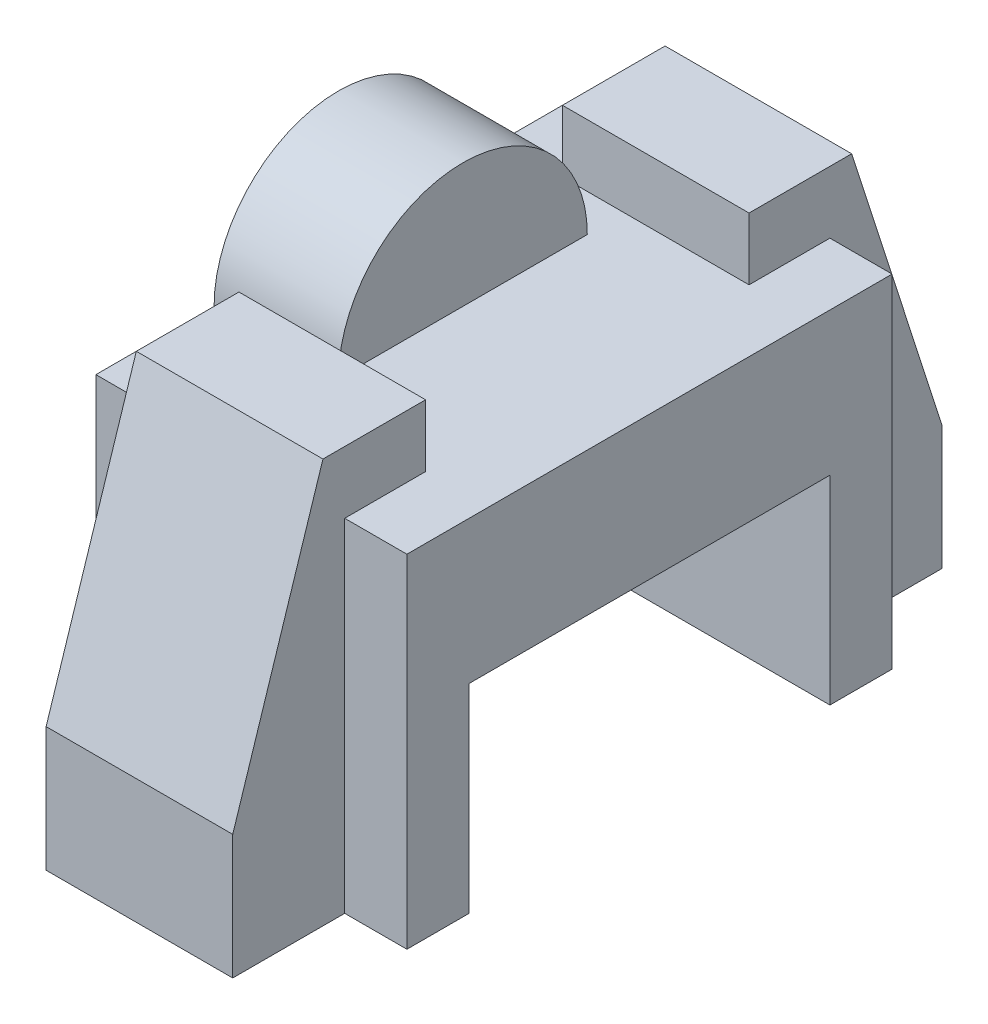
ISO-10303-21;
HEADER;
FILE_DESCRIPTION(('STEP AP214'),'2;1');
FILE_NAME('part.step','',(''),(''),'','','');
FILE_SCHEMA(('AUTOMOTIVE_DESIGN { 1 0 10303 214 1 1 1 1 }'));
ENDSEC;
DATA;
#1=APPLICATION_CONTEXT('core data for automotive mechanical design processes');
#2=APPLICATION_PROTOCOL_DEFINITION('international standard','automotive_design',2000,#1);
#3=PRODUCT_CONTEXT('',#1,'mechanical');
#4=PRODUCT('Part','Part','',(#3));
#5=PRODUCT_RELATED_PRODUCT_CATEGORY('part','',(#4));
#6=PRODUCT_DEFINITION_FORMATION('','',#4);
#7=PRODUCT_DEFINITION_CONTEXT('part definition',#1,'design');
#8=PRODUCT_DEFINITION('design','',#6,#7);
#9=PRODUCT_DEFINITION_SHAPE('','',#8);
#10=(LENGTH_UNIT() NAMED_UNIT(*) SI_UNIT(.MILLI.,.METRE.));
#11=(NAMED_UNIT(*) PLANE_ANGLE_UNIT() SI_UNIT($,.RADIAN.));
#12=(NAMED_UNIT(*) SI_UNIT($,.STERADIAN.) SOLID_ANGLE_UNIT());
#13=UNCERTAINTY_MEASURE_WITH_UNIT(LENGTH_MEASURE(1.E-05),#10,'distance_accuracy_value','');
#14=(GEOMETRIC_REPRESENTATION_CONTEXT(3) GLOBAL_UNCERTAINTY_ASSIGNED_CONTEXT((#13)) GLOBAL_UNIT_ASSIGNED_CONTEXT((#10,
#11,#12)) REPRESENTATION_CONTEXT('',''));
#15=CARTESIAN_POINT('',(0.,0.,0.));
#16=DIRECTION('',(0.,0.,1.));
#17=DIRECTION('',(1.,0.,0.));
#18=AXIS2_PLACEMENT_3D('',#15,#16,#17);
#19=CARTESIAN_POINT('',(25.,27.5,39.));
#20=DIRECTION('',(0.,-1.,0.));
#21=DIRECTION('',(0.,0.,-1.));
#22=AXIS2_PLACEMENT_3D('',#19,#20,#21);
#23=PLANE('',#22);
#24=DIRECTION('',(-1.,0.,0.));
#25=VECTOR('',#24,1.);
#26=CARTESIAN_POINT('',(-5.,27.5,20.));
#27=LINE('',#26,#25);
#28=CARTESIAN_POINT('',(-5.,27.5,20.));
#29=VERTEX_POINT('',#28);
#30=CARTESIAN_POINT('',(-25.,27.5,20.));
#31=VERTEX_POINT('',#30);
#32=EDGE_CURVE('E210',#29,#31,#27,.T.);
#33=ORIENTED_EDGE('',*,*,#32,.T.);
#34=DIRECTION('',(0.,0.,1.));
#35=VECTOR('',#34,1.);
#36=CARTESIAN_POINT('',(-25.,27.5,39.));
#37=LINE('',#36,#35);
#38=CARTESIAN_POINT('',(-25.,27.5,39.));
#39=VERTEX_POINT('',#38);
#40=EDGE_CURVE('E197',#31,#39,#37,.T.);
#41=ORIENTED_EDGE('',*,*,#40,.T.);
#42=DIRECTION('',(-1.,0.,0.));
#43=VECTOR('',#42,1.);
#44=CARTESIAN_POINT('',(25.,27.5,39.));
#45=LINE('',#44,#43);
#46=CARTESIAN_POINT('',(-15.,27.5,39.));
#47=VERTEX_POINT('',#46);
#48=EDGE_CURVE('E333',#47,#39,#45,.T.);
#49=ORIENTED_EDGE('',*,*,#48,.F.);
#50=DIRECTION('',(0.,0.,-1.));
#51=VECTOR('',#50,1.);
#52=CARTESIAN_POINT('',(-15.,27.5,39.));
#53=LINE('',#52,#51);
#54=CARTESIAN_POINT('',(-15.,27.5,26.));
#55=VERTEX_POINT('',#54);
#56=EDGE_CURVE('E255',#47,#55,#53,.T.);
#57=ORIENTED_EDGE('',*,*,#56,.T.);
#58=DIRECTION('',(-1.,0.,0.));
#59=VECTOR('',#58,1.);
#60=CARTESIAN_POINT('',(15.,27.5,26.));
#61=LINE('',#60,#59);
#62=CARTESIAN_POINT('',(15.,27.5,26.));
#63=VERTEX_POINT('',#62);
#64=EDGE_CURVE('E313',#63,#55,#61,.T.);
#65=ORIENTED_EDGE('',*,*,#64,.F.);
#66=DIRECTION('',(0.,0.,-1.));
#67=VECTOR('',#66,1.);
#68=CARTESIAN_POINT('',(15.,27.5,39.));
#69=LINE('',#68,#67);
#70=CARTESIAN_POINT('',(15.,27.5,39.));
#71=VERTEX_POINT('',#70);
#72=EDGE_CURVE('E269',#71,#63,#69,.T.);
#73=ORIENTED_EDGE('',*,*,#72,.F.);
#74=CARTESIAN_POINT('',(25.,27.5,39.));
#75=VERTEX_POINT('',#74);
#76=EDGE_CURVE('E348',#75,#71,#45,.T.);
#77=ORIENTED_EDGE('',*,*,#76,.F.);
#78=DIRECTION('',(0.,0.,1.));
#79=VECTOR('',#78,1.);
#80=CARTESIAN_POINT('',(25.,27.5,39.));
#81=LINE('',#80,#79);
#82=CARTESIAN_POINT('',(25.,27.5,-39.));
#83=VERTEX_POINT('',#82);
#84=EDGE_CURVE('E331',#83,#75,#81,.T.);
#85=ORIENTED_EDGE('',*,*,#84,.F.);
#86=DIRECTION('',(-1.,0.,0.));
#87=VECTOR('',#86,1.);
#88=CARTESIAN_POINT('',(25.,27.5,-39.));
#89=LINE('',#88,#87);
#90=CARTESIAN_POINT('',(15.,27.5,-39.));
#91=VERTEX_POINT('',#90);
#92=EDGE_CURVE('E352',#83,#91,#89,.T.);
#93=ORIENTED_EDGE('',*,*,#92,.T.);
#94=DIRECTION('',(0.,0.,-1.));
#95=VECTOR('',#94,1.);
#96=CARTESIAN_POINT('',(15.,27.5,-39.));
#97=LINE('',#96,#95);
#98=CARTESIAN_POINT('',(15.,27.5,-26.));
#99=VERTEX_POINT('',#98);
#100=EDGE_CURVE('E257',#99,#91,#97,.T.);
#101=ORIENTED_EDGE('',*,*,#100,.F.);
#102=DIRECTION('',(-1.,0.,0.));
#103=VECTOR('',#102,1.);
#104=CARTESIAN_POINT('',(15.,27.5,-26.));
#105=LINE('',#104,#103);
#106=CARTESIAN_POINT('',(-15.,27.5,-26.));
#107=VERTEX_POINT('',#106);
#108=EDGE_CURVE('E233',#99,#107,#105,.T.);
#109=ORIENTED_EDGE('',*,*,#108,.T.);
#110=DIRECTION('',(0.,0.,-1.));
#111=VECTOR('',#110,1.);
#112=CARTESIAN_POINT('',(-15.,27.5,-39.));
#113=LINE('',#112,#111);
#114=CARTESIAN_POINT('',(-15.,27.5,-39.));
#115=VERTEX_POINT('',#114);
#116=EDGE_CURVE('E240',#107,#115,#113,.T.);
#117=ORIENTED_EDGE('',*,*,#116,.T.);
#118=CARTESIAN_POINT('',(-25.,27.5,-39.));
#119=VERTEX_POINT('',#118);
#120=EDGE_CURVE('E351',#115,#119,#89,.T.);
#121=ORIENTED_EDGE('',*,*,#120,.T.);
#122=CARTESIAN_POINT('',(-25.,27.5,-20.));
#123=VERTEX_POINT('',#122);
#124=EDGE_CURVE('E206',#119,#123,#37,.T.);
#125=ORIENTED_EDGE('',*,*,#124,.T.);
#126=DIRECTION('',(-1.,0.,0.));
#127=VECTOR('',#126,1.);
#128=CARTESIAN_POINT('',(-5.,27.5,-20.));
#129=LINE('',#128,#127);
#130=CARTESIAN_POINT('',(-5.,27.5,-20.));
#131=VERTEX_POINT('',#130);
#132=EDGE_CURVE('E57',#131,#123,#129,.T.);
#133=ORIENTED_EDGE('',*,*,#132,.F.);
#134=DIRECTION('',(0.,0.,-1.));
#135=VECTOR('',#134,1.);
#136=CARTESIAN_POINT('',(-5.,27.5,0.));
#137=LINE('',#136,#135);
#138=EDGE_CURVE('E52',#29,#131,#137,.T.);
#139=ORIENTED_EDGE('',*,*,#138,.F.);
#140=EDGE_LOOP('',(#33,#41,#49,#57,#65,#73,#77,#85,#93,#101,#109,#117,#121,#125,#133,#139));
#141=FACE_BOUND('',#140,.T.);
#142=ADVANCED_FACE('F37',(#141),#23,.F.);
#143=CARTESIAN_POINT('',(25.,27.5,-39.));
#144=DIRECTION('',(0.,0.,1.));
#145=DIRECTION('',(1.,0.,0.));
#146=AXIS2_PLACEMENT_3D('',#143,#144,#145);
#147=PLANE('',#146);
#148=DIRECTION('',(0.,-1.,0.));
#149=VECTOR('',#148,1.);
#150=CARTESIAN_POINT('',(15.,-27.5,-39.));
#151=LINE('',#150,#149);
#152=CARTESIAN_POINT('',(15.,-27.5,-39.));
#153=VERTEX_POINT('',#152);
#154=EDGE_CURVE('E236',#91,#153,#151,.T.);
#155=ORIENTED_EDGE('',*,*,#154,.F.);
#156=ORIENTED_EDGE('',*,*,#92,.F.);
#157=DIRECTION('',(0.,1.,0.));
#158=VECTOR('',#157,1.);
#159=CARTESIAN_POINT('',(25.,27.5,-39.));
#160=LINE('',#159,#158);
#161=CARTESIAN_POINT('',(25.,-27.5,-39.));
#162=VERTEX_POINT('',#161);
#163=EDGE_CURVE('E329',#162,#83,#160,.T.);
#164=ORIENTED_EDGE('',*,*,#163,.F.);
#165=DIRECTION('',(-1.,0.,0.));
#166=VECTOR('',#165,1.);
#167=CARTESIAN_POINT('',(25.,-27.5,-39.));
#168=LINE('',#167,#166);
#169=EDGE_CURVE('E356',#162,#153,#168,.T.);
#170=ORIENTED_EDGE('',*,*,#169,.T.);
#171=EDGE_LOOP('',(#155,#156,#164,#170));
#172=FACE_BOUND('',#171,.T.);
#173=ADVANCED_FACE('F405',(#172),#147,.F.);
#174=CARTESIAN_POINT('',(25.,27.5,39.));
#175=DIRECTION('',(0.,0.,-1.));
#176=DIRECTION('',(-1.,0.,0.));
#177=AXIS2_PLACEMENT_3D('',#174,#175,#176);
#178=PLANE('',#177);
#179=DIRECTION('',(0.,1.,0.));
#180=VECTOR('',#179,1.);
#181=CARTESIAN_POINT('',(-15.,-27.5,39.));
#182=LINE('',#181,#180);
#183=CARTESIAN_POINT('',(-15.,-27.5,39.));
#184=VERTEX_POINT('',#183);
#185=EDGE_CURVE('E273',#184,#47,#182,.T.);
#186=ORIENTED_EDGE('',*,*,#185,.T.);
#187=ORIENTED_EDGE('',*,*,#48,.T.);
#188=DIRECTION('',(0.,-1.,0.));
#189=VECTOR('',#188,1.);
#190=CARTESIAN_POINT('',(-25.,27.5,39.));
#191=LINE('',#190,#189);
#192=CARTESIAN_POINT('',(-25.,-27.5,39.));
#193=VERTEX_POINT('',#192);
#194=EDGE_CURVE('E204',#39,#193,#191,.T.);
#195=ORIENTED_EDGE('',*,*,#194,.T.);
#196=DIRECTION('',(-1.,0.,0.));
#197=VECTOR('',#196,1.);
#198=CARTESIAN_POINT('',(25.,-27.5,39.));
#199=LINE('',#198,#197);
#200=EDGE_CURVE('E45',#184,#193,#199,.T.);
#201=ORIENTED_EDGE('',*,*,#200,.F.);
#202=EDGE_LOOP('',(#186,#187,#195,#201));
#203=FACE_BOUND('',#202,.T.);
#204=ADVANCED_FACE('F379',(#203),#178,.F.);
#205=ORIENTED_EDGE('',*,*,#76,.T.);
#206=DIRECTION('',(0.,1.,0.));
#207=VECTOR('',#206,1.);
#208=CARTESIAN_POINT('',(15.,-27.5,39.));
#209=LINE('',#208,#207);
#210=CARTESIAN_POINT('',(15.,-27.5,39.));
#211=VERTEX_POINT('',#210);
#212=EDGE_CURVE('E284',#211,#71,#209,.T.);
#213=ORIENTED_EDGE('',*,*,#212,.F.);
#214=CARTESIAN_POINT('',(25.,-27.5,39.));
#215=VERTEX_POINT('',#214);
#216=EDGE_CURVE('E11',#215,#211,#199,.T.);
#217=ORIENTED_EDGE('',*,*,#216,.F.);
#218=DIRECTION('',(0.,-1.,0.));
#219=VECTOR('',#218,1.);
#220=CARTESIAN_POINT('',(25.,27.5,39.));
#221=LINE('',#220,#219);
#222=EDGE_CURVE('E316',#75,#215,#221,.T.);
#223=ORIENTED_EDGE('',*,*,#222,.F.);
#224=EDGE_LOOP('',(#205,#213,#217,#223));
#225=FACE_BOUND('',#224,.T.);
#226=ADVANCED_FACE('F39',(#225),#178,.F.);
#227=CARTESIAN_POINT('',(25.,-27.5,39.));
#228=DIRECTION('',(0.,1.,0.));
#229=DIRECTION('',(0.,0.,1.));
#230=AXIS2_PLACEMENT_3D('',#227,#228,#229);
#231=PLANE('',#230);
#232=DIRECTION('',(0.,0.,-1.));
#233=VECTOR('',#232,1.);
#234=CARTESIAN_POINT('',(-25.,-27.5,39.));
#235=LINE('',#234,#233);
#236=CARTESIAN_POINT('',(-25.,-27.5,29.));
#237=VERTEX_POINT('',#236);
#238=EDGE_CURVE('E335',#193,#237,#235,.T.);
#239=ORIENTED_EDGE('',*,*,#238,.T.);
#240=DIRECTION('',(-1.,0.,0.));
#241=VECTOR('',#240,1.);
#242=CARTESIAN_POINT('',(25.,-27.5,29.));
#243=LINE('',#242,#241);
#244=CARTESIAN_POINT('',(25.,-27.5,29.));
#245=VERTEX_POINT('',#244);
#246=EDGE_CURVE('E367',#245,#237,#243,.T.);
#247=ORIENTED_EDGE('',*,*,#246,.F.);
#248=DIRECTION('',(0.,0.,-1.));
#249=VECTOR('',#248,1.);
#250=CARTESIAN_POINT('',(25.,-27.5,39.));
#251=LINE('',#250,#249);
#252=EDGE_CURVE('E319',#215,#245,#251,.T.);
#253=ORIENTED_EDGE('',*,*,#252,.F.);
#254=ORIENTED_EDGE('',*,*,#216,.T.);
#255=DIRECTION('',(0.,0.,-1.));
#256=VECTOR('',#255,1.);
#257=CARTESIAN_POINT('',(15.,-27.5,57.));
#258=LINE('',#257,#256);
#259=CARTESIAN_POINT('',(15.,-27.5,57.));
#260=VERTEX_POINT('',#259);
#261=EDGE_CURVE('E281',#260,#211,#258,.T.);
#262=ORIENTED_EDGE('',*,*,#261,.F.);
#263=DIRECTION('',(-1.,0.,0.));
#264=VECTOR('',#263,1.);
#265=CARTESIAN_POINT('',(15.,-27.5,57.));
#266=LINE('',#265,#264);
#267=CARTESIAN_POINT('',(-15.,-27.5,57.));
#268=VERTEX_POINT('',#267);
#269=EDGE_CURVE('E287',#260,#268,#266,.T.);
#270=ORIENTED_EDGE('',*,*,#269,.T.);
#271=DIRECTION('',(0.,0.,-1.));
#272=VECTOR('',#271,1.);
#273=CARTESIAN_POINT('',(-15.,-27.5,57.));
#274=LINE('',#273,#272);
#275=EDGE_CURVE('E297',#268,#184,#274,.T.);
#276=ORIENTED_EDGE('',*,*,#275,.T.);
#277=ORIENTED_EDGE('',*,*,#200,.T.);
#278=EDGE_LOOP('',(#239,#247,#253,#254,#262,#270,#276,#277));
#279=FACE_BOUND('',#278,.T.);
#280=ADVANCED_FACE('F374',(#279),#231,.F.);
#281=CARTESIAN_POINT('',(25.,-27.5,29.));
#282=DIRECTION('',(0.,0.,1.));
#283=DIRECTION('',(1.,0.,0.));
#284=AXIS2_PLACEMENT_3D('',#281,#282,#283);
#285=PLANE('',#284);
#286=DIRECTION('',(0.,1.,0.));
#287=VECTOR('',#286,1.);
#288=CARTESIAN_POINT('',(-25.,-27.5,29.));
#289=LINE('',#288,#287);
#290=CARTESIAN_POINT('',(-25.,4.5,29.));
#291=VERTEX_POINT('',#290);
#292=EDGE_CURVE('E337',#237,#291,#289,.T.);
#293=ORIENTED_EDGE('',*,*,#292,.T.);
#294=DIRECTION('',(-1.,0.,0.));
#295=VECTOR('',#294,1.);
#296=CARTESIAN_POINT('',(25.,4.5,29.));
#297=LINE('',#296,#295);
#298=CARTESIAN_POINT('',(25.,4.5,29.));
#299=VERTEX_POINT('',#298);
#300=EDGE_CURVE('E365',#299,#291,#297,.T.);
#301=ORIENTED_EDGE('',*,*,#300,.F.);
#302=DIRECTION('',(0.,1.,0.));
#303=VECTOR('',#302,1.);
#304=CARTESIAN_POINT('',(25.,-27.5,29.));
#305=LINE('',#304,#303);
#306=EDGE_CURVE('E321',#245,#299,#305,.T.);
#307=ORIENTED_EDGE('',*,*,#306,.F.);
#308=ORIENTED_EDGE('',*,*,#246,.T.);
#309=EDGE_LOOP('',(#293,#301,#307,#308));
#310=FACE_BOUND('',#309,.T.);
#311=ADVANCED_FACE('F450',(#310),#285,.F.);
#312=CARTESIAN_POINT('',(25.,4.5,29.));
#313=DIRECTION('',(0.,1.,0.));
#314=DIRECTION('',(0.,0.,1.));
#315=AXIS2_PLACEMENT_3D('',#312,#313,#314);
#316=PLANE('',#315);
#317=DIRECTION('',(0.,0.,-1.));
#318=VECTOR('',#317,1.);
#319=CARTESIAN_POINT('',(-25.,4.5,29.));
#320=LINE('',#319,#318);
#321=CARTESIAN_POINT('',(-25.,4.5,-29.));
#322=VERTEX_POINT('',#321);
#323=EDGE_CURVE('E339',#291,#322,#320,.T.);
#324=ORIENTED_EDGE('',*,*,#323,.T.);
#325=DIRECTION('',(-1.,0.,0.));
#326=VECTOR('',#325,1.);
#327=CARTESIAN_POINT('',(25.,4.5,-29.));
#328=LINE('',#327,#326);
#329=CARTESIAN_POINT('',(25.,4.5,-29.));
#330=VERTEX_POINT('',#329);
#331=EDGE_CURVE('E362',#330,#322,#328,.T.);
#332=ORIENTED_EDGE('',*,*,#331,.F.);
#333=DIRECTION('',(0.,0.,-1.));
#334=VECTOR('',#333,1.);
#335=CARTESIAN_POINT('',(25.,4.5,29.));
#336=LINE('',#335,#334);
#337=EDGE_CURVE('E323',#299,#330,#336,.T.);
#338=ORIENTED_EDGE('',*,*,#337,.F.);
#339=ORIENTED_EDGE('',*,*,#300,.T.);
#340=EDGE_LOOP('',(#324,#332,#338,#339));
#341=FACE_BOUND('',#340,.T.);
#342=ADVANCED_FACE('F448',(#341),#316,.F.);
#343=CARTESIAN_POINT('',(25.,-27.5,-29.));
#344=DIRECTION('',(0.,0.,-1.));
#345=DIRECTION('',(-1.,0.,0.));
#346=AXIS2_PLACEMENT_3D('',#343,#344,#345);
#347=PLANE('',#346);
#348=DIRECTION('',(0.,-1.,0.));
#349=VECTOR('',#348,1.);
#350=CARTESIAN_POINT('',(-25.,-27.5,-29.));
#351=LINE('',#350,#349);
#352=CARTESIAN_POINT('',(-25.,-27.5,-29.));
#353=VERTEX_POINT('',#352);
#354=EDGE_CURVE('E341',#322,#353,#351,.T.);
#355=ORIENTED_EDGE('',*,*,#354,.T.);
#356=DIRECTION('',(-1.,0.,0.));
#357=VECTOR('',#356,1.);
#358=CARTESIAN_POINT('',(25.,-27.5,-29.));
#359=LINE('',#358,#357);
#360=CARTESIAN_POINT('',(25.,-27.5,-29.));
#361=VERTEX_POINT('',#360);
#362=EDGE_CURVE('E359',#361,#353,#359,.T.);
#363=ORIENTED_EDGE('',*,*,#362,.F.);
#364=DIRECTION('',(0.,-1.,0.));
#365=VECTOR('',#364,1.);
#366=CARTESIAN_POINT('',(25.,-27.5,-29.));
#367=LINE('',#366,#365);
#368=EDGE_CURVE('E325',#330,#361,#367,.T.);
#369=ORIENTED_EDGE('',*,*,#368,.F.);
#370=ORIENTED_EDGE('',*,*,#331,.T.);
#371=EDGE_LOOP('',(#355,#363,#369,#370));
#372=FACE_BOUND('',#371,.T.);
#373=ADVANCED_FACE('F444',(#372),#347,.F.);
#374=CARTESIAN_POINT('',(25.,-27.5,-29.));
#375=DIRECTION('',(0.,1.,0.));
#376=DIRECTION('',(0.,0.,1.));
#377=AXIS2_PLACEMENT_3D('',#374,#375,#376);
#378=PLANE('',#377);
#379=DIRECTION('',(0.,0.,-1.));
#380=VECTOR('',#379,1.);
#381=CARTESIAN_POINT('',(-25.,-27.5,-29.));
#382=LINE('',#381,#380);
#383=CARTESIAN_POINT('',(-25.,-27.5,-39.));
#384=VERTEX_POINT('',#383);
#385=EDGE_CURVE('E343',#353,#384,#382,.T.);
#386=ORIENTED_EDGE('',*,*,#385,.T.);
#387=CARTESIAN_POINT('',(-15.,-27.5,-39.));
#388=VERTEX_POINT('',#387);
#389=EDGE_CURVE('E355',#388,#384,#168,.T.);
#390=ORIENTED_EDGE('',*,*,#389,.F.);
#391=DIRECTION('',(0.,0.,-1.));
#392=VECTOR('',#391,1.);
#393=CARTESIAN_POINT('',(-15.,-27.5,-57.));
#394=LINE('',#393,#392);
#395=CARTESIAN_POINT('',(-15.,-27.5,-57.));
#396=VERTEX_POINT('',#395);
#397=EDGE_CURVE('E252',#388,#396,#394,.T.);
#398=ORIENTED_EDGE('',*,*,#397,.T.);
#399=DIRECTION('',(-1.,0.,0.));
#400=VECTOR('',#399,1.);
#401=CARTESIAN_POINT('',(15.,-27.5,-57.));
#402=LINE('',#401,#400);
#403=CARTESIAN_POINT('',(15.,-27.5,-57.));
#404=VERTEX_POINT('',#403);
#405=EDGE_CURVE('E213',#404,#396,#402,.T.);
#406=ORIENTED_EDGE('',*,*,#405,.F.);
#407=DIRECTION('',(0.,0.,-1.));
#408=VECTOR('',#407,1.);
#409=CARTESIAN_POINT('',(15.,-27.5,-57.));
#410=LINE('',#409,#408);
#411=EDGE_CURVE('E241',#153,#404,#410,.T.);
#412=ORIENTED_EDGE('',*,*,#411,.F.);
#413=ORIENTED_EDGE('',*,*,#169,.F.);
#414=DIRECTION('',(0.,0.,-1.));
#415=VECTOR('',#414,1.);
#416=CARTESIAN_POINT('',(25.,-27.5,-29.));
#417=LINE('',#416,#415);
#418=EDGE_CURVE('E327',#361,#162,#417,.T.);
#419=ORIENTED_EDGE('',*,*,#418,.F.);
#420=ORIENTED_EDGE('',*,*,#362,.T.);
#421=EDGE_LOOP('',(#386,#390,#398,#406,#412,#413,#419,#420));
#422=FACE_BOUND('',#421,.T.);
#423=ADVANCED_FACE('F412',(#422),#378,.F.);
#424=ORIENTED_EDGE('',*,*,#120,.F.);
#425=DIRECTION('',(0.,-1.,0.));
#426=VECTOR('',#425,1.);
#427=CARTESIAN_POINT('',(-15.,-27.5,-39.));
#428=LINE('',#427,#426);
#429=EDGE_CURVE('E237',#115,#388,#428,.T.);
#430=ORIENTED_EDGE('',*,*,#429,.T.);
#431=ORIENTED_EDGE('',*,*,#389,.T.);
#432=DIRECTION('',(0.,1.,0.));
#433=VECTOR('',#432,1.);
#434=CARTESIAN_POINT('',(-25.,27.5,-39.));
#435=LINE('',#434,#433);
#436=EDGE_CURVE('E207',#384,#119,#435,.T.);
#437=ORIENTED_EDGE('',*,*,#436,.T.);
#438=EDGE_LOOP('',(#424,#430,#431,#437));
#439=FACE_BOUND('',#438,.T.);
#440=ADVANCED_FACE('F437',(#439),#147,.F.);
#441=CARTESIAN_POINT('',(25.,0.,0.));
#442=DIRECTION('',(1.,0.,0.));
#443=DIRECTION('',(0.,0.,-1.));
#444=AXIS2_PLACEMENT_3D('',#441,#442,#443);
#445=PLANE('',#444);
#446=ORIENTED_EDGE('',*,*,#222,.T.);
#447=ORIENTED_EDGE('',*,*,#252,.T.);
#448=ORIENTED_EDGE('',*,*,#306,.T.);
#449=ORIENTED_EDGE('',*,*,#337,.T.);
#450=ORIENTED_EDGE('',*,*,#368,.T.);
#451=ORIENTED_EDGE('',*,*,#418,.T.);
#452=ORIENTED_EDGE('',*,*,#163,.T.);
#453=ORIENTED_EDGE('',*,*,#84,.T.);
#454=EDGE_LOOP('',(#446,#447,#448,#449,#450,#451,#452,#453));
#455=FACE_BOUND('',#454,.T.);
#456=ADVANCED_FACE('F399',(#455),#445,.T.);
#457=CARTESIAN_POINT('',(-25.,0.,0.));
#458=DIRECTION('',(1.,0.,0.));
#459=DIRECTION('',(0.,0.,-1.));
#460=AXIS2_PLACEMENT_3D('',#457,#458,#459);
#461=PLANE('',#460);
#462=ORIENTED_EDGE('',*,*,#194,.F.);
#463=ORIENTED_EDGE('',*,*,#40,.F.);
#464=CARTESIAN_POINT('',(-25.,27.5,0.));
#465=DIRECTION('',(1.,0.,0.));
#466=DIRECTION('',(0.,0.,-1.));
#467=AXIS2_PLACEMENT_3D('',#464,#465,#466);
#468=CIRCLE('',#467,20.);
#469=EDGE_CURVE('E201',#123,#31,#468,.T.);
#470=ORIENTED_EDGE('',*,*,#469,.F.);
#471=ORIENTED_EDGE('',*,*,#124,.F.);
#472=ORIENTED_EDGE('',*,*,#436,.F.);
#473=ORIENTED_EDGE('',*,*,#385,.F.);
#474=ORIENTED_EDGE('',*,*,#354,.F.);
#475=ORIENTED_EDGE('',*,*,#323,.F.);
#476=ORIENTED_EDGE('',*,*,#292,.F.);
#477=ORIENTED_EDGE('',*,*,#238,.F.);
#478=EDGE_LOOP('',(#462,#463,#470,#471,#472,#473,#474,#475,#476,#477));
#479=FACE_BOUND('',#478,.T.);
#480=ADVANCED_FACE('F198',(#479),#461,.F.);
#481=CARTESIAN_POINT('',(15.,27.5,26.));
#482=DIRECTION('',(0.,0.,1.));
#483=DIRECTION('',(1.,0.,0.));
#484=AXIS2_PLACEMENT_3D('',#481,#482,#483);
#485=PLANE('',#484);
#486=DIRECTION('',(0.,1.,0.));
#487=VECTOR('',#486,1.);
#488=CARTESIAN_POINT('',(-15.,27.5,26.));
#489=LINE('',#488,#487);
#490=CARTESIAN_POINT('',(-15.,37.5,26.));
#491=VERTEX_POINT('',#490);
#492=EDGE_CURVE('E289',#55,#491,#489,.T.);
#493=ORIENTED_EDGE('',*,*,#492,.T.);
#494=DIRECTION('',(-1.,0.,0.));
#495=VECTOR('',#494,1.);
#496=CARTESIAN_POINT('',(15.,37.5,26.));
#497=LINE('',#496,#495);
#498=CARTESIAN_POINT('',(15.,37.5,26.));
#499=VERTEX_POINT('',#498);
#500=EDGE_CURVE('E310',#499,#491,#497,.T.);
#501=ORIENTED_EDGE('',*,*,#500,.F.);
#502=DIRECTION('',(0.,1.,0.));
#503=VECTOR('',#502,1.);
#504=CARTESIAN_POINT('',(15.,27.5,26.));
#505=LINE('',#504,#503);
#506=EDGE_CURVE('E272',#63,#499,#505,.T.);
#507=ORIENTED_EDGE('',*,*,#506,.F.);
#508=ORIENTED_EDGE('',*,*,#64,.T.);
#509=EDGE_LOOP('',(#493,#501,#507,#508));
#510=FACE_BOUND('',#509,.T.);
#511=ADVANCED_FACE('F389',(#510),#485,.F.);
#512=CARTESIAN_POINT('',(15.,37.5,26.));
#513=DIRECTION('',(0.,-1.,0.));
#514=DIRECTION('',(0.,0.,-1.));
#515=AXIS2_PLACEMENT_3D('',#512,#513,#514);
#516=PLANE('',#515);
#517=DIRECTION('',(0.,0.,1.));
#518=VECTOR('',#517,1.);
#519=CARTESIAN_POINT('',(-15.,37.5,26.));
#520=LINE('',#519,#518);
#521=CARTESIAN_POINT('',(-15.,37.5,42.5));
#522=VERTEX_POINT('',#521);
#523=EDGE_CURVE('E291',#491,#522,#520,.T.);
#524=ORIENTED_EDGE('',*,*,#523,.T.);
#525=DIRECTION('',(-1.,0.,0.));
#526=VECTOR('',#525,1.);
#527=CARTESIAN_POINT('',(15.,37.5,42.5));
#528=LINE('',#527,#526);
#529=CARTESIAN_POINT('',(15.,37.5,42.5));
#530=VERTEX_POINT('',#529);
#531=EDGE_CURVE('E307',#530,#522,#528,.T.);
#532=ORIENTED_EDGE('',*,*,#531,.F.);
#533=DIRECTION('',(0.,0.,1.));
#534=VECTOR('',#533,1.);
#535=CARTESIAN_POINT('',(15.,37.5,26.));
#536=LINE('',#535,#534);
#537=EDGE_CURVE('E275',#499,#530,#536,.T.);
#538=ORIENTED_EDGE('',*,*,#537,.F.);
#539=ORIENTED_EDGE('',*,*,#500,.T.);
#540=EDGE_LOOP('',(#524,#532,#538,#539));
#541=FACE_BOUND('',#540,.T.);
#542=ADVANCED_FACE('F502',(#541),#516,.F.);
#543=CARTESIAN_POINT('',(15.,37.5,42.5));
#544=DIRECTION('',(0.,-0.306693767453372,-0.951808243820811));
#545=DIRECTION('',(0.,0.951808243820811,-0.306693767453372));
#546=AXIS2_PLACEMENT_3D('',#543,#544,#545);
#547=PLANE('',#546);
#548=DIRECTION('',(0.,-0.951808243820811,0.306693767453372));
#549=VECTOR('',#548,1.);
#550=CARTESIAN_POINT('',(-15.,37.5,42.5));
#551=LINE('',#550,#549);
#552=CARTESIAN_POINT('',(-15.,-7.5,57.));
#553=VERTEX_POINT('',#552);
#554=EDGE_CURVE('E293',#522,#553,#551,.T.);
#555=ORIENTED_EDGE('',*,*,#554,.T.);
#556=DIRECTION('',(-1.,0.,0.));
#557=VECTOR('',#556,1.);
#558=CARTESIAN_POINT('',(15.,-7.5,57.));
#559=LINE('',#558,#557);
#560=CARTESIAN_POINT('',(15.,-7.5,57.));
#561=VERTEX_POINT('',#560);
#562=EDGE_CURVE('E304',#561,#553,#559,.T.);
#563=ORIENTED_EDGE('',*,*,#562,.F.);
#564=DIRECTION('',(0.,-0.951808243820811,0.306693767453372));
#565=VECTOR('',#564,1.);
#566=CARTESIAN_POINT('',(15.,37.5,42.5));
#567=LINE('',#566,#565);
#568=EDGE_CURVE('E277',#530,#561,#567,.T.);
#569=ORIENTED_EDGE('',*,*,#568,.F.);
#570=ORIENTED_EDGE('',*,*,#531,.T.);
#571=EDGE_LOOP('',(#555,#563,#569,#570));
#572=FACE_BOUND('',#571,.T.);
#573=ADVANCED_FACE('F509',(#572),#547,.F.);
#574=CARTESIAN_POINT('',(15.,-7.5,57.));
#575=DIRECTION('',(0.,0.,-1.));
#576=DIRECTION('',(-1.,0.,0.));
#577=AXIS2_PLACEMENT_3D('',#574,#575,#576);
#578=PLANE('',#577);
#579=DIRECTION('',(0.,-1.,0.));
#580=VECTOR('',#579,1.);
#581=CARTESIAN_POINT('',(-15.,-7.5,57.));
#582=LINE('',#581,#580);
#583=EDGE_CURVE('E295',#553,#268,#582,.T.);
#584=ORIENTED_EDGE('',*,*,#583,.T.);
#585=ORIENTED_EDGE('',*,*,#269,.F.);
#586=DIRECTION('',(0.,-1.,0.));
#587=VECTOR('',#586,1.);
#588=CARTESIAN_POINT('',(15.,-7.5,57.));
#589=LINE('',#588,#587);
#590=EDGE_CURVE('E279',#561,#260,#589,.T.);
#591=ORIENTED_EDGE('',*,*,#590,.F.);
#592=ORIENTED_EDGE('',*,*,#562,.T.);
#593=EDGE_LOOP('',(#584,#585,#591,#592));
#594=FACE_BOUND('',#593,.T.);
#595=ADVANCED_FACE('F517',(#594),#578,.F.);
#596=CARTESIAN_POINT('',(15.,0.,0.));
#597=DIRECTION('',(1.,0.,0.));
#598=DIRECTION('',(0.,0.,-1.));
#599=AXIS2_PLACEMENT_3D('',#596,#597,#598);
#600=PLANE('',#599);
#601=ORIENTED_EDGE('',*,*,#72,.T.);
#602=ORIENTED_EDGE('',*,*,#506,.T.);
#603=ORIENTED_EDGE('',*,*,#537,.T.);
#604=ORIENTED_EDGE('',*,*,#568,.T.);
#605=ORIENTED_EDGE('',*,*,#590,.T.);
#606=ORIENTED_EDGE('',*,*,#261,.T.);
#607=ORIENTED_EDGE('',*,*,#212,.T.);
#608=EDGE_LOOP('',(#601,#602,#603,#604,#605,#606,#607));
#609=FACE_BOUND('',#608,.T.);
#610=ADVANCED_FACE('F392',(#609),#600,.T.);
#611=CARTESIAN_POINT('',(-15.,0.,0.));
#612=DIRECTION('',(1.,0.,0.));
#613=DIRECTION('',(0.,0.,-1.));
#614=AXIS2_PLACEMENT_3D('',#611,#612,#613);
#615=PLANE('',#614);
#616=ORIENTED_EDGE('',*,*,#56,.F.);
#617=ORIENTED_EDGE('',*,*,#185,.F.);
#618=ORIENTED_EDGE('',*,*,#275,.F.);
#619=ORIENTED_EDGE('',*,*,#583,.F.);
#620=ORIENTED_EDGE('',*,*,#554,.F.);
#621=ORIENTED_EDGE('',*,*,#523,.F.);
#622=ORIENTED_EDGE('',*,*,#492,.F.);
#623=EDGE_LOOP('',(#616,#617,#618,#619,#620,#621,#622));
#624=FACE_BOUND('',#623,.T.);
#625=ADVANCED_FACE('F385',(#624),#615,.F.);
#626=CARTESIAN_POINT('',(15.,-7.49999999999999,-57.));
#627=DIRECTION('',(0.,0.,1.));
#628=DIRECTION('',(0.,-1.,0.));
#629=AXIS2_PLACEMENT_3D('',#626,#627,#628);
#630=PLANE('',#629);
#631=DIRECTION('',(0.,1.,0.));
#632=VECTOR('',#631,1.);
#633=CARTESIAN_POINT('',(-15.,-7.49999999999999,-57.));
#634=LINE('',#633,#632);
#635=CARTESIAN_POINT('',(-15.,-7.49999999999999,-57.));
#636=VERTEX_POINT('',#635);
#637=EDGE_CURVE('E250',#396,#636,#634,.T.);
#638=ORIENTED_EDGE('',*,*,#637,.T.);
#639=DIRECTION('',(-1.,0.,0.));
#640=VECTOR('',#639,1.);
#641=CARTESIAN_POINT('',(15.,-7.49999999999999,-57.));
#642=LINE('',#641,#640);
#643=CARTESIAN_POINT('',(15.,-7.49999999999999,-57.));
#644=VERTEX_POINT('',#643);
#645=EDGE_CURVE('E224',#644,#636,#642,.T.);
#646=ORIENTED_EDGE('',*,*,#645,.F.);
#647=DIRECTION('',(0.,1.,0.));
#648=VECTOR('',#647,1.);
#649=CARTESIAN_POINT('',(15.,-7.49999999999999,-57.));
#650=LINE('',#649,#648);
#651=EDGE_CURVE('E265',#404,#644,#650,.T.);
#652=ORIENTED_EDGE('',*,*,#651,.F.);
#653=ORIENTED_EDGE('',*,*,#405,.T.);
#654=EDGE_LOOP('',(#638,#646,#652,#653));
#655=FACE_BOUND('',#654,.T.);
#656=ADVANCED_FACE('F416',(#655),#630,.F.);
#657=CARTESIAN_POINT('',(15.,37.5,-42.5));
#658=DIRECTION('',(0.,-0.306693767453373,0.951808243820811));
#659=DIRECTION('',(0.,-0.951808243820811,-0.306693767453373));
#660=AXIS2_PLACEMENT_3D('',#657,#658,#659);
#661=PLANE('',#660);
#662=DIRECTION('',(0.,0.951808243820811,0.306693767453373));
#663=VECTOR('',#662,1.);
#664=CARTESIAN_POINT('',(-15.,37.5,-42.5));
#665=LINE('',#664,#663);
#666=CARTESIAN_POINT('',(-15.,37.5,-42.5));
#667=VERTEX_POINT('',#666);
#668=EDGE_CURVE('E248',#636,#667,#665,.T.);
#669=ORIENTED_EDGE('',*,*,#668,.T.);
#670=DIRECTION('',(-1.,0.,0.));
#671=VECTOR('',#670,1.);
#672=CARTESIAN_POINT('',(15.,37.5,-42.5));
#673=LINE('',#672,#671);
#674=CARTESIAN_POINT('',(15.,37.5,-42.5));
#675=VERTEX_POINT('',#674);
#676=EDGE_CURVE('E227',#675,#667,#673,.T.);
#677=ORIENTED_EDGE('',*,*,#676,.F.);
#678=DIRECTION('',(0.,0.951808243820811,0.306693767453373));
#679=VECTOR('',#678,1.);
#680=CARTESIAN_POINT('',(15.,37.5,-42.5));
#681=LINE('',#680,#679);
#682=EDGE_CURVE('E263',#644,#675,#681,.T.);
#683=ORIENTED_EDGE('',*,*,#682,.F.);
#684=ORIENTED_EDGE('',*,*,#645,.T.);
#685=EDGE_LOOP('',(#669,#677,#683,#684));
#686=FACE_BOUND('',#685,.T.);
#687=ADVANCED_FACE('F423',(#686),#661,.F.);
#688=CARTESIAN_POINT('',(15.,37.5,-26.));
#689=DIRECTION('',(0.,-1.,0.));
#690=DIRECTION('',(0.,0.,-1.));
#691=AXIS2_PLACEMENT_3D('',#688,#689,#690);
#692=PLANE('',#691);
#693=DIRECTION('',(0.,0.,1.));
#694=VECTOR('',#693,1.);
#695=CARTESIAN_POINT('',(-15.,37.5,-26.));
#696=LINE('',#695,#694);
#697=CARTESIAN_POINT('',(-15.,37.5,-26.));
#698=VERTEX_POINT('',#697);
#699=EDGE_CURVE('E246',#667,#698,#696,.T.);
#700=ORIENTED_EDGE('',*,*,#699,.T.);
#701=DIRECTION('',(-1.,0.,0.));
#702=VECTOR('',#701,1.);
#703=CARTESIAN_POINT('',(15.,37.5,-26.));
#704=LINE('',#703,#702);
#705=CARTESIAN_POINT('',(15.,37.5,-26.));
#706=VERTEX_POINT('',#705);
#707=EDGE_CURVE('E230',#706,#698,#704,.T.);
#708=ORIENTED_EDGE('',*,*,#707,.F.);
#709=DIRECTION('',(0.,0.,1.));
#710=VECTOR('',#709,1.);
#711=CARTESIAN_POINT('',(15.,37.5,-26.));
#712=LINE('',#711,#710);
#713=EDGE_CURVE('E261',#675,#706,#712,.T.);
#714=ORIENTED_EDGE('',*,*,#713,.F.);
#715=ORIENTED_EDGE('',*,*,#676,.T.);
#716=EDGE_LOOP('',(#700,#708,#714,#715));
#717=FACE_BOUND('',#716,.T.);
#718=ADVANCED_FACE('F427',(#717),#692,.F.);
#719=CARTESIAN_POINT('',(15.,27.5,-26.));
#720=DIRECTION('',(0.,0.,-1.));
#721=DIRECTION('',(-1.,0.,0.));
#722=AXIS2_PLACEMENT_3D('',#719,#720,#721);
#723=PLANE('',#722);
#724=DIRECTION('',(0.,-1.,0.));
#725=VECTOR('',#724,1.);
#726=CARTESIAN_POINT('',(-15.,27.5,-26.));
#727=LINE('',#726,#725);
#728=EDGE_CURVE('E244',#698,#107,#727,.T.);
#729=ORIENTED_EDGE('',*,*,#728,.T.);
#730=ORIENTED_EDGE('',*,*,#108,.F.);
#731=DIRECTION('',(0.,-1.,0.));
#732=VECTOR('',#731,1.);
#733=CARTESIAN_POINT('',(15.,27.5,-26.));
#734=LINE('',#733,#732);
#735=EDGE_CURVE('E259',#706,#99,#734,.T.);
#736=ORIENTED_EDGE('',*,*,#735,.F.);
#737=ORIENTED_EDGE('',*,*,#707,.T.);
#738=EDGE_LOOP('',(#729,#730,#736,#737));
#739=FACE_BOUND('',#738,.T.);
#740=ADVANCED_FACE('F432',(#739),#723,.F.);
#741=CARTESIAN_POINT('',(15.,0.,0.));
#742=DIRECTION('',(-1.,0.,0.));
#743=DIRECTION('',(0.,0.,1.));
#744=AXIS2_PLACEMENT_3D('',#741,#742,#743);
#745=PLANE('',#744);
#746=ORIENTED_EDGE('',*,*,#411,.T.);
#747=ORIENTED_EDGE('',*,*,#651,.T.);
#748=ORIENTED_EDGE('',*,*,#682,.T.);
#749=ORIENTED_EDGE('',*,*,#713,.T.);
#750=ORIENTED_EDGE('',*,*,#735,.T.);
#751=ORIENTED_EDGE('',*,*,#100,.T.);
#752=ORIENTED_EDGE('',*,*,#154,.T.);
#753=EDGE_LOOP('',(#746,#747,#748,#749,#750,#751,#752));
#754=FACE_BOUND('',#753,.T.);
#755=ADVANCED_FACE('F409',(#754),#745,.F.);
#756=CARTESIAN_POINT('',(-15.,0.,0.));
#757=DIRECTION('',(-1.,0.,0.));
#758=DIRECTION('',(0.,0.,1.));
#759=AXIS2_PLACEMENT_3D('',#756,#757,#758);
#760=PLANE('',#759);
#761=ORIENTED_EDGE('',*,*,#397,.F.);
#762=ORIENTED_EDGE('',*,*,#429,.F.);
#763=ORIENTED_EDGE('',*,*,#116,.F.);
#764=ORIENTED_EDGE('',*,*,#728,.F.);
#765=ORIENTED_EDGE('',*,*,#699,.F.);
#766=ORIENTED_EDGE('',*,*,#668,.F.);
#767=ORIENTED_EDGE('',*,*,#637,.F.);
#768=EDGE_LOOP('',(#761,#762,#763,#764,#765,#766,#767));
#769=FACE_BOUND('',#768,.T.);
#770=ADVANCED_FACE('F568',(#769),#760,.T.);
#771=CARTESIAN_POINT('',(-5.,27.5,0.));
#772=DIRECTION('',(-1.,0.,0.));
#773=DIRECTION('',(0.,0.,1.));
#774=AXIS2_PLACEMENT_3D('',#771,#772,#773);
#775=CYLINDRICAL_SURFACE('',#774,20.);
#776=ORIENTED_EDGE('',*,*,#469,.T.);
#777=ORIENTED_EDGE('',*,*,#32,.F.);
#778=CARTESIAN_POINT('',(-5.,27.5,0.));
#779=DIRECTION('',(1.,0.,0.));
#780=DIRECTION('',(0.,0.,-1.));
#781=AXIS2_PLACEMENT_3D('',#778,#779,#780);
#782=CIRCLE('',#781,20.);
#783=EDGE_CURVE('E216',#131,#29,#782,.T.);
#784=ORIENTED_EDGE('',*,*,#783,.F.);
#785=ORIENTED_EDGE('',*,*,#132,.T.);
#786=EDGE_LOOP('',(#776,#777,#784,#785));
#787=FACE_BOUND('',#786,.T.);
#788=ADVANCED_FACE('F215',(#787),#775,.T.);
#789=CARTESIAN_POINT('',(-5.,27.5,0.));
#790=DIRECTION('',(1.,0.,0.));
#791=DIRECTION('',(0.,0.,-1.));
#792=AXIS2_PLACEMENT_3D('',#789,#790,#791);
#793=PLANE('',#792);
#794=ORIENTED_EDGE('',*,*,#783,.T.);
#795=ORIENTED_EDGE('',*,*,#138,.T.);
#796=EDGE_LOOP('',(#794,#795));
#797=FACE_BOUND('',#796,.T.);
#798=ADVANCED_FACE('F580',(#797),#793,.T.);
#799=CLOSED_SHELL('',(#142,#173,#204,#226,#280,#311,#342,#373,#423,#440,#456,#480,#511,#542,
#573,#595,#610,#625,#656,#687,#718,#740,#755,#770,#788,#798));
#800=MANIFOLD_SOLID_BREP('B2',#799);
#801=ADVANCED_BREP_SHAPE_REPRESENTATION('',(#18,#800),#14);
#802=SHAPE_DEFINITION_REPRESENTATION(#9,#801);
ENDSEC;
END-ISO-10303-21;
